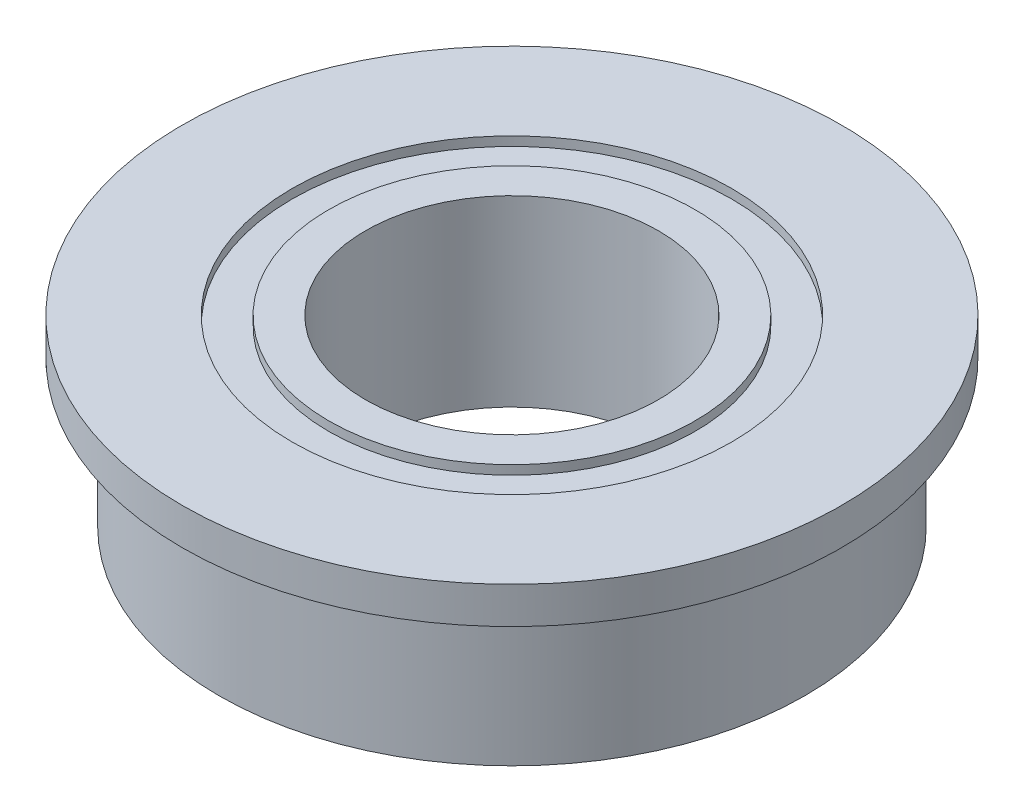
ISO-10303-21;
HEADER;
FILE_DESCRIPTION(('STEP AP214'),'2;1');
FILE_NAME('part.step','',(''),(''),'','','');
FILE_SCHEMA(('AUTOMOTIVE_DESIGN { 1 0 10303 214 1 1 1 1 }'));
ENDSEC;
DATA;
#1=APPLICATION_CONTEXT('core data for automotive mechanical design processes');
#2=APPLICATION_PROTOCOL_DEFINITION('international standard','automotive_design',2000,#1);
#3=PRODUCT_CONTEXT('',#1,'mechanical');
#4=PRODUCT('Part','Part','',(#3));
#5=PRODUCT_RELATED_PRODUCT_CATEGORY('part','',(#4));
#6=PRODUCT_DEFINITION_FORMATION('','',#4);
#7=PRODUCT_DEFINITION_CONTEXT('part definition',#1,'design');
#8=PRODUCT_DEFINITION('design','',#6,#7);
#9=PRODUCT_DEFINITION_SHAPE('','',#8);
#10=(LENGTH_UNIT() NAMED_UNIT(*) SI_UNIT(.MILLI.,.METRE.));
#11=(NAMED_UNIT(*) PLANE_ANGLE_UNIT() SI_UNIT($,.RADIAN.));
#12=(NAMED_UNIT(*) SI_UNIT($,.STERADIAN.) SOLID_ANGLE_UNIT());
#13=UNCERTAINTY_MEASURE_WITH_UNIT(LENGTH_MEASURE(1.E-05),#10,'distance_accuracy_value','');
#14=(GEOMETRIC_REPRESENTATION_CONTEXT(3) GLOBAL_UNCERTAINTY_ASSIGNED_CONTEXT((#13)) GLOBAL_UNIT_ASSIGNED_CONTEXT((#10,
#11,#12)) REPRESENTATION_CONTEXT('',''));
#15=CARTESIAN_POINT('',(0.,0.,0.));
#16=DIRECTION('',(0.,0.,1.));
#17=DIRECTION('',(1.,0.,0.));
#18=AXIS2_PLACEMENT_3D('',#15,#16,#17);
#19=CARTESIAN_POINT('',(0.,2.5,-6.));
#20=DIRECTION('',(0.,-1.,0.));
#21=DIRECTION('',(0.,0.,-1.));
#22=AXIS2_PLACEMENT_3D('',#19,#20,#21);
#23=PLANE('',#22);
#24=CARTESIAN_POINT('',(0.,2.5,0.));
#25=DIRECTION('',(0.,1.,0.));
#26=DIRECTION('',(0.,0.,1.));
#27=AXIS2_PLACEMENT_3D('',#24,#25,#26);
#28=CIRCLE('',#27,6.);
#29=CARTESIAN_POINT('',(0.,2.5,6.));
#30=VERTEX_POINT('',#29);
#31=EDGE_CURVE('E86',#30,#30,#28,.T.);
#32=ORIENTED_EDGE('',*,*,#31,.F.);
#33=EDGE_LOOP('',(#32));
#34=FACE_BOUND('',#33,.T.);
#35=CARTESIAN_POINT('',(0.,2.5,0.));
#36=DIRECTION('',(0.,1.,0.));
#37=DIRECTION('',(0.,0.,1.));
#38=AXIS2_PLACEMENT_3D('',#35,#36,#37);
#39=CIRCLE('',#38,9.);
#40=CARTESIAN_POINT('',(0.,2.5,9.));
#41=VERTEX_POINT('',#40);
#42=EDGE_CURVE('E10',#41,#41,#39,.T.);
#43=ORIENTED_EDGE('',*,*,#42,.T.);
#44=EDGE_LOOP('',(#43));
#45=FACE_BOUND('',#44,.T.);
#46=ADVANCED_FACE('F35',(#34,#45),#23,.F.);
#47=CARTESIAN_POINT('',(0.,0.,0.));
#48=DIRECTION('',(0.,1.,0.));
#49=DIRECTION('',(0.,0.,1.));
#50=AXIS2_PLACEMENT_3D('',#47,#48,#49);
#51=CYLINDRICAL_SURFACE('',#50,9.);
#52=ORIENTED_EDGE('',*,*,#42,.F.);
#53=EDGE_LOOP('',(#52));
#54=FACE_BOUND('',#53,.T.);
#55=CARTESIAN_POINT('',(0.,1.5,0.));
#56=DIRECTION('',(0.,1.,0.));
#57=DIRECTION('',(0.,0.,1.));
#58=AXIS2_PLACEMENT_3D('',#55,#56,#57);
#59=CIRCLE('',#58,9.);
#60=CARTESIAN_POINT('',(0.,1.5,9.));
#61=VERTEX_POINT('',#60);
#62=EDGE_CURVE('E41',#61,#61,#59,.T.);
#63=ORIENTED_EDGE('',*,*,#62,.T.);
#64=EDGE_LOOP('',(#63));
#65=FACE_BOUND('',#64,.T.);
#66=ADVANCED_FACE('F94',(#54,#65),#51,.T.);
#67=CARTESIAN_POINT('',(0.,1.5,-9.));
#68=DIRECTION('',(0.,1.,0.));
#69=DIRECTION('',(0.,0.,1.));
#70=AXIS2_PLACEMENT_3D('',#67,#68,#69);
#71=PLANE('',#70);
#72=ORIENTED_EDGE('',*,*,#62,.F.);
#73=EDGE_LOOP('',(#72));
#74=FACE_BOUND('',#73,.T.);
#75=CARTESIAN_POINT('',(0.,1.5,0.));
#76=DIRECTION('',(0.,1.,0.));
#77=DIRECTION('',(0.,0.,1.));
#78=AXIS2_PLACEMENT_3D('',#75,#76,#77);
#79=CIRCLE('',#78,8.);
#80=CARTESIAN_POINT('',(0.,1.5,8.));
#81=VERTEX_POINT('',#80);
#82=EDGE_CURVE('E45',#81,#81,#79,.T.);
#83=ORIENTED_EDGE('',*,*,#82,.T.);
#84=EDGE_LOOP('',(#83));
#85=FACE_BOUND('',#84,.T.);
#86=ADVANCED_FACE('F98',(#74,#85),#71,.F.);
#87=CARTESIAN_POINT('',(0.,0.,0.));
#88=DIRECTION('',(0.,1.,0.));
#89=DIRECTION('',(0.,0.,1.));
#90=AXIS2_PLACEMENT_3D('',#87,#88,#89);
#91=CYLINDRICAL_SURFACE('',#90,8.);
#92=ORIENTED_EDGE('',*,*,#82,.F.);
#93=EDGE_LOOP('',(#92));
#94=FACE_BOUND('',#93,.T.);
#95=CARTESIAN_POINT('',(0.,-2.5,0.));
#96=DIRECTION('',(0.,1.,0.));
#97=DIRECTION('',(0.,0.,1.));
#98=AXIS2_PLACEMENT_3D('',#95,#96,#97);
#99=CIRCLE('',#98,8.);
#100=CARTESIAN_POINT('',(0.,-2.5,8.));
#101=VERTEX_POINT('',#100);
#102=EDGE_CURVE('E50',#101,#101,#99,.T.);
#103=ORIENTED_EDGE('',*,*,#102,.T.);
#104=EDGE_LOOP('',(#103));
#105=FACE_BOUND('',#104,.T.);
#106=ADVANCED_FACE('F103',(#94,#105),#91,.T.);
#107=CARTESIAN_POINT('',(0.,-2.5,-8.));
#108=DIRECTION('',(0.,1.,0.));
#109=DIRECTION('',(0.,0.,1.));
#110=AXIS2_PLACEMENT_3D('',#107,#108,#109);
#111=PLANE('',#110);
#112=ORIENTED_EDGE('',*,*,#102,.F.);
#113=EDGE_LOOP('',(#112));
#114=FACE_BOUND('',#113,.T.);
#115=CARTESIAN_POINT('',(0.,-2.5,0.));
#116=DIRECTION('',(0.,1.,0.));
#117=DIRECTION('',(0.,0.,1.));
#118=AXIS2_PLACEMENT_3D('',#115,#116,#117);
#119=CIRCLE('',#118,6.);
#120=CARTESIAN_POINT('',(0.,-2.5,6.));
#121=VERTEX_POINT('',#120);
#122=EDGE_CURVE('E56',#121,#121,#119,.T.);
#123=ORIENTED_EDGE('',*,*,#122,.T.);
#124=EDGE_LOOP('',(#123));
#125=FACE_BOUND('',#124,.T.);
#126=ADVANCED_FACE('F109',(#114,#125),#111,.F.);
#127=CARTESIAN_POINT('',(0.,0.,0.));
#128=DIRECTION('',(0.,1.,0.));
#129=DIRECTION('',(0.,0.,1.));
#130=AXIS2_PLACEMENT_3D('',#127,#128,#129);
#131=CYLINDRICAL_SURFACE('',#130,6.);
#132=ORIENTED_EDGE('',*,*,#122,.F.);
#133=EDGE_LOOP('',(#132));
#134=FACE_BOUND('',#133,.T.);
#135=CARTESIAN_POINT('',(0.,-2.25,0.));
#136=DIRECTION('',(0.,1.,0.));
#137=DIRECTION('',(0.,0.,1.));
#138=AXIS2_PLACEMENT_3D('',#135,#136,#137);
#139=CIRCLE('',#138,6.);
#140=CARTESIAN_POINT('',(0.,-2.25,6.));
#141=VERTEX_POINT('',#140);
#142=EDGE_CURVE('E59',#141,#141,#139,.T.);
#143=ORIENTED_EDGE('',*,*,#142,.T.);
#144=EDGE_LOOP('',(#143));
#145=FACE_BOUND('',#144,.T.);
#146=ADVANCED_FACE('F113',(#134,#145),#131,.F.);
#147=CARTESIAN_POINT('',(0.,-2.25,-6.));
#148=DIRECTION('',(0.,1.,0.));
#149=DIRECTION('',(0.,0.,1.));
#150=AXIS2_PLACEMENT_3D('',#147,#148,#149);
#151=PLANE('',#150);
#152=ORIENTED_EDGE('',*,*,#142,.F.);
#153=EDGE_LOOP('',(#152));
#154=FACE_BOUND('',#153,.T.);
#155=CARTESIAN_POINT('',(0.,-2.25,0.));
#156=DIRECTION('',(0.,1.,0.));
#157=DIRECTION('',(0.,0.,1.));
#158=AXIS2_PLACEMENT_3D('',#155,#156,#157);
#159=CIRCLE('',#158,5.);
#160=CARTESIAN_POINT('',(0.,-2.25,5.));
#161=VERTEX_POINT('',#160);
#162=EDGE_CURVE('E62',#161,#161,#159,.T.);
#163=ORIENTED_EDGE('',*,*,#162,.T.);
#164=EDGE_LOOP('',(#163));
#165=FACE_BOUND('',#164,.T.);
#166=ADVANCED_FACE('F117',(#154,#165),#151,.F.);
#167=CARTESIAN_POINT('',(0.,0.,0.));
#168=DIRECTION('',(0.,1.,0.));
#169=DIRECTION('',(0.,0.,1.));
#170=AXIS2_PLACEMENT_3D('',#167,#168,#169);
#171=CYLINDRICAL_SURFACE('',#170,5.);
#172=ORIENTED_EDGE('',*,*,#162,.F.);
#173=EDGE_LOOP('',(#172));
#174=FACE_BOUND('',#173,.T.);
#175=CARTESIAN_POINT('',(0.,-2.5,0.));
#176=DIRECTION('',(0.,1.,0.));
#177=DIRECTION('',(0.,0.,1.));
#178=AXIS2_PLACEMENT_3D('',#175,#176,#177);
#179=CIRCLE('',#178,5.);
#180=CARTESIAN_POINT('',(0.,-2.5,5.));
#181=VERTEX_POINT('',#180);
#182=EDGE_CURVE('E65',#181,#181,#179,.T.);
#183=ORIENTED_EDGE('',*,*,#182,.T.);
#184=EDGE_LOOP('',(#183));
#185=FACE_BOUND('',#184,.T.);
#186=ADVANCED_FACE('F121',(#174,#185),#171,.T.);
#187=CARTESIAN_POINT('',(0.,-2.5,-5.));
#188=DIRECTION('',(0.,1.,0.));
#189=DIRECTION('',(0.,0.,1.));
#190=AXIS2_PLACEMENT_3D('',#187,#188,#189);
#191=PLANE('',#190);
#192=ORIENTED_EDGE('',*,*,#182,.F.);
#193=EDGE_LOOP('',(#192));
#194=FACE_BOUND('',#193,.T.);
#195=CARTESIAN_POINT('',(0.,-2.5,0.));
#196=DIRECTION('',(0.,1.,0.));
#197=DIRECTION('',(0.,0.,1.));
#198=AXIS2_PLACEMENT_3D('',#195,#196,#197);
#199=CIRCLE('',#198,4.);
#200=CARTESIAN_POINT('',(0.,-2.5,4.));
#201=VERTEX_POINT('',#200);
#202=EDGE_CURVE('E68',#201,#201,#199,.T.);
#203=ORIENTED_EDGE('',*,*,#202,.T.);
#204=EDGE_LOOP('',(#203));
#205=FACE_BOUND('',#204,.T.);
#206=ADVANCED_FACE('F125',(#194,#205),#191,.F.);
#207=CARTESIAN_POINT('',(0.,0.,0.));
#208=DIRECTION('',(0.,1.,0.));
#209=DIRECTION('',(0.,0.,1.));
#210=AXIS2_PLACEMENT_3D('',#207,#208,#209);
#211=CYLINDRICAL_SURFACE('',#210,4.);
#212=ORIENTED_EDGE('',*,*,#202,.F.);
#213=EDGE_LOOP('',(#212));
#214=FACE_BOUND('',#213,.T.);
#215=CARTESIAN_POINT('',(0.,2.5,0.));
#216=DIRECTION('',(0.,1.,0.));
#217=DIRECTION('',(0.,0.,1.));
#218=AXIS2_PLACEMENT_3D('',#215,#216,#217);
#219=CIRCLE('',#218,4.);
#220=CARTESIAN_POINT('',(0.,2.5,4.));
#221=VERTEX_POINT('',#220);
#222=EDGE_CURVE('E71',#221,#221,#219,.T.);
#223=ORIENTED_EDGE('',*,*,#222,.T.);
#224=EDGE_LOOP('',(#223));
#225=FACE_BOUND('',#224,.T.);
#226=ADVANCED_FACE('F129',(#214,#225),#211,.F.);
#227=CARTESIAN_POINT('',(0.,2.5,-4.));
#228=DIRECTION('',(0.,-1.,0.));
#229=DIRECTION('',(0.,0.,-1.));
#230=AXIS2_PLACEMENT_3D('',#227,#228,#229);
#231=PLANE('',#230);
#232=ORIENTED_EDGE('',*,*,#222,.F.);
#233=EDGE_LOOP('',(#232));
#234=FACE_BOUND('',#233,.T.);
#235=CARTESIAN_POINT('',(0.,2.5,0.));
#236=DIRECTION('',(0.,1.,0.));
#237=DIRECTION('',(0.,0.,1.));
#238=AXIS2_PLACEMENT_3D('',#235,#236,#237);
#239=CIRCLE('',#238,5.);
#240=CARTESIAN_POINT('',(0.,2.5,5.));
#241=VERTEX_POINT('',#240);
#242=EDGE_CURVE('E74',#241,#241,#239,.T.);
#243=ORIENTED_EDGE('',*,*,#242,.T.);
#244=EDGE_LOOP('',(#243));
#245=FACE_BOUND('',#244,.T.);
#246=ADVANCED_FACE('F133',(#234,#245),#231,.F.);
#247=CARTESIAN_POINT('',(0.,0.,0.));
#248=DIRECTION('',(0.,1.,0.));
#249=DIRECTION('',(0.,0.,1.));
#250=AXIS2_PLACEMENT_3D('',#247,#248,#249);
#251=CYLINDRICAL_SURFACE('',#250,5.);
#252=ORIENTED_EDGE('',*,*,#242,.F.);
#253=EDGE_LOOP('',(#252));
#254=FACE_BOUND('',#253,.T.);
#255=CARTESIAN_POINT('',(0.,2.25,0.));
#256=DIRECTION('',(0.,1.,0.));
#257=DIRECTION('',(0.,0.,1.));
#258=AXIS2_PLACEMENT_3D('',#255,#256,#257);
#259=CIRCLE('',#258,5.);
#260=CARTESIAN_POINT('',(0.,2.25,5.));
#261=VERTEX_POINT('',#260);
#262=EDGE_CURVE('E78',#261,#261,#259,.T.);
#263=ORIENTED_EDGE('',*,*,#262,.T.);
#264=EDGE_LOOP('',(#263));
#265=FACE_BOUND('',#264,.T.);
#266=ADVANCED_FACE('F137',(#254,#265),#251,.T.);
#267=CARTESIAN_POINT('',(0.,2.25,-5.));
#268=DIRECTION('',(0.,-1.,0.));
#269=DIRECTION('',(0.,0.,-1.));
#270=AXIS2_PLACEMENT_3D('',#267,#268,#269);
#271=PLANE('',#270);
#272=ORIENTED_EDGE('',*,*,#262,.F.);
#273=EDGE_LOOP('',(#272));
#274=FACE_BOUND('',#273,.T.);
#275=CARTESIAN_POINT('',(0.,2.25,0.));
#276=DIRECTION('',(0.,1.,0.));
#277=DIRECTION('',(0.,0.,1.));
#278=AXIS2_PLACEMENT_3D('',#275,#276,#277);
#279=CIRCLE('',#278,6.);
#280=CARTESIAN_POINT('',(0.,2.25,6.));
#281=VERTEX_POINT('',#280);
#282=EDGE_CURVE('E82',#281,#281,#279,.T.);
#283=ORIENTED_EDGE('',*,*,#282,.T.);
#284=EDGE_LOOP('',(#283));
#285=FACE_BOUND('',#284,.T.);
#286=ADVANCED_FACE('F141',(#274,#285),#271,.F.);
#287=CARTESIAN_POINT('',(0.,0.,0.));
#288=DIRECTION('',(0.,1.,0.));
#289=DIRECTION('',(0.,0.,1.));
#290=AXIS2_PLACEMENT_3D('',#287,#288,#289);
#291=CYLINDRICAL_SURFACE('',#290,6.);
#292=ORIENTED_EDGE('',*,*,#282,.F.);
#293=EDGE_LOOP('',(#292));
#294=FACE_BOUND('',#293,.T.);
#295=ORIENTED_EDGE('',*,*,#31,.T.);
#296=EDGE_LOOP('',(#295));
#297=FACE_BOUND('',#296,.T.);
#298=ADVANCED_FACE('F91',(#294,#297),#291,.F.);
#299=CLOSED_SHELL('',(#46,#66,#86,#106,#126,#146,#166,#186,#206,#226,#246,#266,#286,#298));
#300=MANIFOLD_SOLID_BREP('B2',#299);
#301=ADVANCED_BREP_SHAPE_REPRESENTATION('',(#18,#300),#14);
#302=SHAPE_DEFINITION_REPRESENTATION(#9,#301);
ENDSEC;
END-ISO-10303-21;
